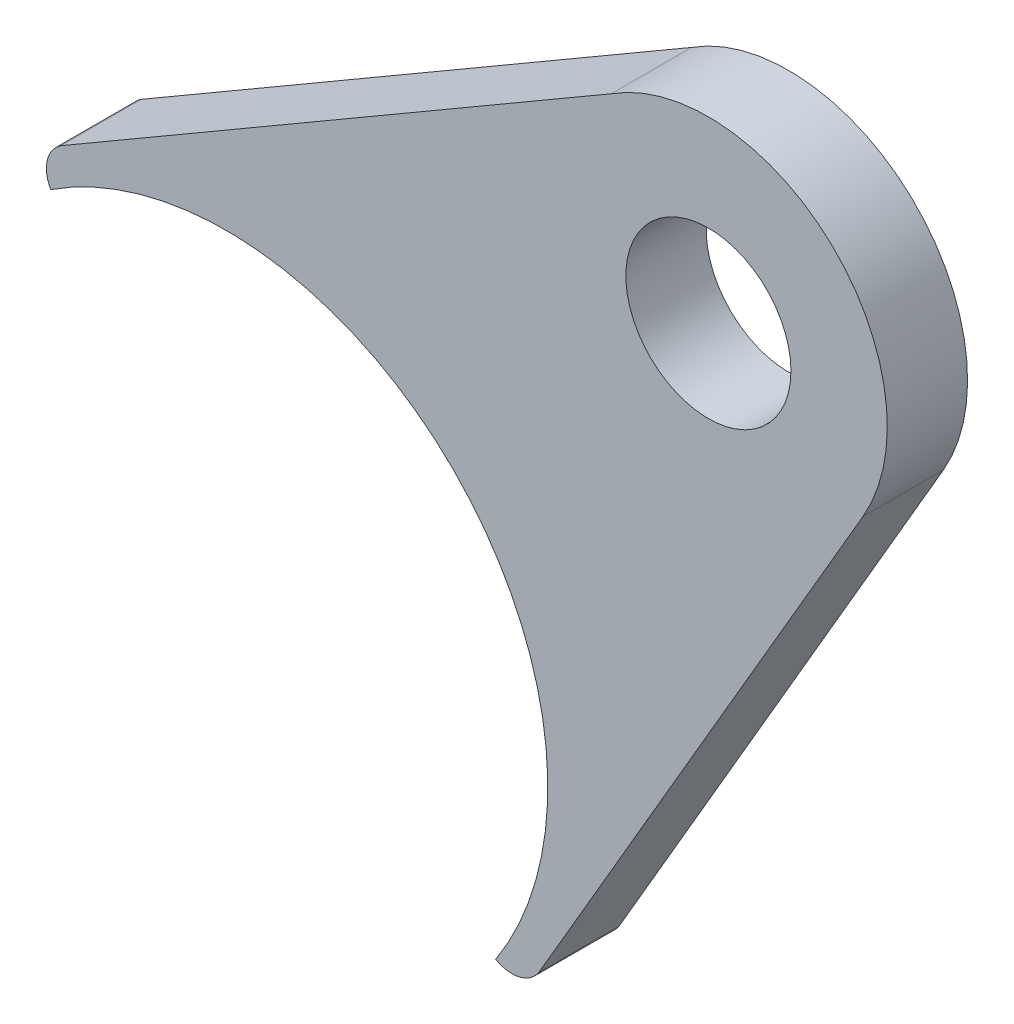
ISO-10303-21;
HEADER;
FILE_DESCRIPTION(('STEP AP214'),'2;1');
FILE_NAME('part.step','',(''),(''),'','','');
FILE_SCHEMA(('AUTOMOTIVE_DESIGN { 1 0 10303 214 1 1 1 1 }'));
ENDSEC;
DATA;
#1=APPLICATION_CONTEXT('core data for automotive mechanical design processes');
#2=APPLICATION_PROTOCOL_DEFINITION('international standard','automotive_design',2000,#1);
#3=PRODUCT_CONTEXT('',#1,'mechanical');
#4=PRODUCT('Part','Part','',(#3));
#5=PRODUCT_RELATED_PRODUCT_CATEGORY('part','',(#4));
#6=PRODUCT_DEFINITION_FORMATION('','',#4);
#7=PRODUCT_DEFINITION_CONTEXT('part definition',#1,'design');
#8=PRODUCT_DEFINITION('design','',#6,#7);
#9=PRODUCT_DEFINITION_SHAPE('','',#8);
#10=(LENGTH_UNIT() NAMED_UNIT(*) SI_UNIT(.MILLI.,.METRE.));
#11=(NAMED_UNIT(*) PLANE_ANGLE_UNIT() SI_UNIT($,.RADIAN.));
#12=(NAMED_UNIT(*) SI_UNIT($,.STERADIAN.) SOLID_ANGLE_UNIT());
#13=UNCERTAINTY_MEASURE_WITH_UNIT(LENGTH_MEASURE(1.E-05),#10,'distance_accuracy_value','');
#14=(GEOMETRIC_REPRESENTATION_CONTEXT(3) GLOBAL_UNCERTAINTY_ASSIGNED_CONTEXT((#13)) GLOBAL_UNIT_ASSIGNED_CONTEXT((#10,
#11,#12)) REPRESENTATION_CONTEXT('',''));
#15=CARTESIAN_POINT('',(0.,0.,0.));
#16=DIRECTION('',(0.,0.,1.));
#17=DIRECTION('',(1.,0.,0.));
#18=AXIS2_PLACEMENT_3D('',#15,#16,#17);
#19=CARTESIAN_POINT('',(-5.85837434433906,11.2675371729913,3.175));
#20=DIRECTION('',(0.,0.,-1.));
#21=DIRECTION('',(-1.,0.,0.));
#22=AXIS2_PLACEMENT_3D('',#19,#20,#21);
#23=PLANE('',#22);
#24=CARTESIAN_POINT('',(-5.85837434433906,11.2675371729913,3.175));
#25=DIRECTION('',(0.,0.,1.));
#26=DIRECTION('',(-1.,0.,0.));
#27=AXIS2_PLACEMENT_3D('',#24,#25,#26);
#28=CIRCLE('',#27,1.26999999999994);
#29=CARTESIAN_POINT('',(-6.54906316048158,12.3332993224671,3.175));
#30=VERTEX_POINT('',#29);
#31=CARTESIAN_POINT('',(-6.9547066047242,10.6264790049294,3.175));
#32=VERTEX_POINT('',#31);
#33=EDGE_CURVE('E141',#30,#32,#28,.T.);
#34=ORIENTED_EDGE('',*,*,#33,.T.);
#35=CARTESIAN_POINT('',(0.,0.,3.175));
#36=DIRECTION('',(0.,0.,-1.));
#37=DIRECTION('',(1.,0.,0.));
#38=AXIS2_PLACEMENT_3D('',#35,#36,#37);
#39=CIRCLE('',#38,12.7);
#40=CARTESIAN_POINT('',(10.6407084109418,-6.93291601804849,3.175));
#41=VERTEX_POINT('',#40);
#42=EDGE_CURVE('E99',#32,#41,#39,.T.);
#43=ORIENTED_EDGE('',*,*,#42,.T.);
#44=CARTESIAN_POINT('',(11.2818459493319,-5.83663017171689,3.175));
#45=DIRECTION('',(0.,0.,1.));
#46=DIRECTION('',(1.,0.,0.));
#47=AXIS2_PLACEMENT_3D('',#44,#45,#46);
#48=CIRCLE('',#47,1.27);
#49=CARTESIAN_POINT('',(12.3488934742751,-6.52533154351209,3.175));
#50=VERTEX_POINT('',#49);
#51=EDGE_CURVE('E112',#41,#50,#48,.T.);
#52=ORIENTED_EDGE('',*,*,#51,.T.);
#53=DIRECTION('',(0.503040153440547,0.864263040993025,0.));
#54=VECTOR('',#53,1.);
#55=CARTESIAN_POINT('',(12.3488934742751,-6.52533154351209,3.175));
#56=LINE('',#55,#54);
#57=CARTESIAN_POINT('',(25.1637103256806,15.4915442585769,3.175));
#58=VERTEX_POINT('',#57);
#59=EDGE_CURVE('E106',#50,#58,#56,.T.);
#60=ORIENTED_EDGE('',*,*,#59,.T.);
#61=CARTESIAN_POINT('',(19.05,19.05,3.175));
#62=DIRECTION('',(0.,0.,1.));
#63=DIRECTION('',(1.,0.,0.));
#64=AXIS2_PLACEMENT_3D('',#61,#62,#63);
#65=CIRCLE('',#64,7.07389999999995);
#66=CARTESIAN_POINT('',(15.2028632940858,24.9862951725809,3.175));
#67=VERTEX_POINT('',#66);
#68=EDGE_CURVE('E110',#58,#67,#65,.T.);
#69=ORIENTED_EDGE('',*,*,#68,.T.);
#70=DIRECTION('',(-0.86439446197605,-0.502814293855232,0.));
#71=VECTOR('',#70,1.);
#72=CARTESIAN_POINT('',(-6.54906316048158,12.3332993224671,3.175));
#73=LINE('',#72,#71);
#74=EDGE_CURVE('E62',#67,#30,#73,.T.);
#75=ORIENTED_EDGE('',*,*,#74,.T.);
#76=EDGE_LOOP('',(#34,#43,#52,#60,#69,#75));
#77=FACE_BOUND('',#76,.T.);
#78=CARTESIAN_POINT('',(19.05,19.05,3.175));
#79=DIRECTION('',(0.,0.,1.));
#80=DIRECTION('',(1.,0.,0.));
#81=AXIS2_PLACEMENT_3D('',#78,#79,#80);
#82=CIRCLE('',#81,3.2639);
#83=CARTESIAN_POINT('',(22.3139,19.05,3.175));
#84=VERTEX_POINT('',#83);
#85=EDGE_CURVE('E134',#84,#84,#82,.T.);
#86=ORIENTED_EDGE('',*,*,#85,.F.);
#87=EDGE_LOOP('',(#86));
#88=FACE_BOUND('',#87,.T.);
#89=ADVANCED_FACE('F45',(#77,#88),#23,.F.);
#90=CARTESIAN_POINT('',(-5.85837434433906,11.2675371729913,0.));
#91=DIRECTION('',(0.,0.,-1.));
#92=DIRECTION('',(-1.,0.,0.));
#93=AXIS2_PLACEMENT_3D('',#90,#91,#92);
#94=PLANE('',#93);
#95=CARTESIAN_POINT('',(-5.85837434433906,11.2675371729913,0.));
#96=DIRECTION('',(0.,0.,1.));
#97=DIRECTION('',(-1.,0.,0.));
#98=AXIS2_PLACEMENT_3D('',#95,#96,#97);
#99=CIRCLE('',#98,1.26999999999994);
#100=CARTESIAN_POINT('',(-6.54906316048158,12.3332993224671,0.));
#101=VERTEX_POINT('',#100);
#102=CARTESIAN_POINT('',(-6.9547066047242,10.6264790049294,0.));
#103=VERTEX_POINT('',#102);
#104=EDGE_CURVE('E130',#101,#103,#99,.T.);
#105=ORIENTED_EDGE('',*,*,#104,.F.);
#106=DIRECTION('',(-0.86439446197605,-0.502814293855232,0.));
#107=VECTOR('',#106,1.);
#108=CARTESIAN_POINT('',(-6.54906316048158,12.3332993224671,0.));
#109=LINE('',#108,#107);
#110=CARTESIAN_POINT('',(15.2028632940858,24.9862951725809,0.));
#111=VERTEX_POINT('',#110);
#112=EDGE_CURVE('E91',#111,#101,#109,.T.);
#113=ORIENTED_EDGE('',*,*,#112,.F.);
#114=CARTESIAN_POINT('',(19.05,19.05,0.));
#115=DIRECTION('',(0.,0.,1.));
#116=DIRECTION('',(1.,0.,0.));
#117=AXIS2_PLACEMENT_3D('',#114,#115,#116);
#118=CIRCLE('',#117,7.07389999999995);
#119=CARTESIAN_POINT('',(25.1637103256806,15.4915442585769,0.));
#120=VERTEX_POINT('',#119);
#121=EDGE_CURVE('E85',#120,#111,#118,.T.);
#122=ORIENTED_EDGE('',*,*,#121,.F.);
#123=DIRECTION('',(0.503040153440547,0.864263040993025,0.));
#124=VECTOR('',#123,1.);
#125=CARTESIAN_POINT('',(12.3488934742751,-6.52533154351209,0.));
#126=LINE('',#125,#124);
#127=CARTESIAN_POINT('',(12.3488934742751,-6.52533154351209,0.));
#128=VERTEX_POINT('',#127);
#129=EDGE_CURVE('E120',#128,#120,#126,.T.);
#130=ORIENTED_EDGE('',*,*,#129,.F.);
#131=CARTESIAN_POINT('',(11.2818459493319,-5.83663017171689,0.));
#132=DIRECTION('',(0.,0.,1.));
#133=DIRECTION('',(1.,0.,0.));
#134=AXIS2_PLACEMENT_3D('',#131,#132,#133);
#135=CIRCLE('',#134,1.27);
#136=CARTESIAN_POINT('',(10.6407084109418,-6.93291601804849,0.));
#137=VERTEX_POINT('',#136);
#138=EDGE_CURVE('E136',#137,#128,#135,.T.);
#139=ORIENTED_EDGE('',*,*,#138,.F.);
#140=CARTESIAN_POINT('',(0.,0.,0.));
#141=DIRECTION('',(0.,0.,-1.));
#142=DIRECTION('',(1.,0.,0.));
#143=AXIS2_PLACEMENT_3D('',#140,#141,#142);
#144=CIRCLE('',#143,12.7);
#145=EDGE_CURVE('E133',#103,#137,#144,.T.);
#146=ORIENTED_EDGE('',*,*,#145,.F.);
#147=EDGE_LOOP('',(#105,#113,#122,#130,#139,#146));
#148=FACE_BOUND('',#147,.T.);
#149=CARTESIAN_POINT('',(19.05,19.05,0.));
#150=DIRECTION('',(0.,0.,1.));
#151=DIRECTION('',(1.,0.,0.));
#152=AXIS2_PLACEMENT_3D('',#149,#150,#151);
#153=CIRCLE('',#152,3.2639);
#154=CARTESIAN_POINT('',(22.3139,19.05,0.));
#155=VERTEX_POINT('',#154);
#156=EDGE_CURVE('E234',#155,#155,#153,.T.);
#157=ORIENTED_EDGE('',*,*,#156,.T.);
#158=EDGE_LOOP('',(#157));
#159=FACE_BOUND('',#158,.T.);
#160=ADVANCED_FACE('F150',(#148,#159),#94,.T.);
#161=CARTESIAN_POINT('',(-5.85837434433906,11.2675371729913,3.175));
#162=DIRECTION('',(0.,0.,-1.));
#163=DIRECTION('',(-1.,0.,0.));
#164=AXIS2_PLACEMENT_3D('',#161,#162,#163);
#165=CYLINDRICAL_SURFACE('',#164,1.26999999999994);
#166=ORIENTED_EDGE('',*,*,#104,.T.);
#167=DIRECTION('',(0.,0.,-1.));
#168=VECTOR('',#167,1.);
#169=CARTESIAN_POINT('',(-6.9547066047242,10.6264790049294,3.175));
#170=LINE('',#169,#168);
#171=EDGE_CURVE('E11',#32,#103,#170,.T.);
#172=ORIENTED_EDGE('',*,*,#171,.F.);
#173=ORIENTED_EDGE('',*,*,#33,.F.);
#174=DIRECTION('',(0.,0.,-1.));
#175=VECTOR('',#174,1.);
#176=CARTESIAN_POINT('',(-6.54906316048158,12.3332993224671,3.175));
#177=LINE('',#176,#175);
#178=EDGE_CURVE('E126',#30,#101,#177,.T.);
#179=ORIENTED_EDGE('',*,*,#178,.T.);
#180=EDGE_LOOP('',(#166,#172,#173,#179));
#181=FACE_BOUND('',#180,.T.);
#182=ADVANCED_FACE('F47',(#181),#165,.T.);
#183=CARTESIAN_POINT('',(0.,0.,3.175));
#184=DIRECTION('',(0.,0.,-1.));
#185=DIRECTION('',(-1.,0.,0.));
#186=AXIS2_PLACEMENT_3D('',#183,#184,#185);
#187=CYLINDRICAL_SURFACE('',#186,12.7);
#188=ORIENTED_EDGE('',*,*,#145,.T.);
#189=DIRECTION('',(0.,0.,-1.));
#190=VECTOR('',#189,1.);
#191=CARTESIAN_POINT('',(10.6407084109418,-6.93291601804849,3.175));
#192=LINE('',#191,#190);
#193=EDGE_CURVE('E54',#41,#137,#192,.T.);
#194=ORIENTED_EDGE('',*,*,#193,.F.);
#195=ORIENTED_EDGE('',*,*,#42,.F.);
#196=ORIENTED_EDGE('',*,*,#171,.T.);
#197=EDGE_LOOP('',(#188,#194,#195,#196));
#198=FACE_BOUND('',#197,.T.);
#199=ADVANCED_FACE('F175',(#198),#187,.F.);
#200=CARTESIAN_POINT('',(11.2818459493319,-5.83663017171689,3.175));
#201=DIRECTION('',(0.,0.,-1.));
#202=DIRECTION('',(-1.,0.,0.));
#203=AXIS2_PLACEMENT_3D('',#200,#201,#202);
#204=CYLINDRICAL_SURFACE('',#203,1.27);
#205=ORIENTED_EDGE('',*,*,#138,.T.);
#206=DIRECTION('',(0.,0.,-1.));
#207=VECTOR('',#206,1.);
#208=CARTESIAN_POINT('',(12.3488934742751,-6.52533154351209,3.175));
#209=LINE('',#208,#207);
#210=EDGE_CURVE('E121',#50,#128,#209,.T.);
#211=ORIENTED_EDGE('',*,*,#210,.F.);
#212=ORIENTED_EDGE('',*,*,#51,.F.);
#213=ORIENTED_EDGE('',*,*,#193,.T.);
#214=EDGE_LOOP('',(#205,#211,#212,#213));
#215=FACE_BOUND('',#214,.T.);
#216=ADVANCED_FACE('F147',(#215),#204,.T.);
#217=CARTESIAN_POINT('',(12.3488934742751,-6.52533154351209,3.175));
#218=DIRECTION('',(-0.864263040993025,0.503040153440547,0.));
#219=DIRECTION('',(-0.503040153440547,-0.864263040993025,0.));
#220=AXIS2_PLACEMENT_3D('',#217,#218,#219);
#221=PLANE('',#220);
#222=ORIENTED_EDGE('',*,*,#129,.T.);
#223=DIRECTION('',(0.,0.,-1.));
#224=VECTOR('',#223,1.);
#225=CARTESIAN_POINT('',(25.1637103256806,15.4915442585769,3.175));
#226=LINE('',#225,#224);
#227=EDGE_CURVE('E117',#58,#120,#226,.T.);
#228=ORIENTED_EDGE('',*,*,#227,.F.);
#229=ORIENTED_EDGE('',*,*,#59,.F.);
#230=ORIENTED_EDGE('',*,*,#210,.T.);
#231=EDGE_LOOP('',(#222,#228,#229,#230));
#232=FACE_BOUND('',#231,.T.);
#233=ADVANCED_FACE('F118',(#232),#221,.F.);
#234=CARTESIAN_POINT('',(19.05,19.05,3.175));
#235=DIRECTION('',(0.,0.,-1.));
#236=DIRECTION('',(-1.,0.,0.));
#237=AXIS2_PLACEMENT_3D('',#234,#235,#236);
#238=CYLINDRICAL_SURFACE('',#237,7.07389999999995);
#239=ORIENTED_EDGE('',*,*,#121,.T.);
#240=DIRECTION('',(0.,0.,-1.));
#241=VECTOR('',#240,1.);
#242=CARTESIAN_POINT('',(15.2028632940858,24.9862951725809,3.175));
#243=LINE('',#242,#241);
#244=EDGE_CURVE('E122',#67,#111,#243,.T.);
#245=ORIENTED_EDGE('',*,*,#244,.F.);
#246=ORIENTED_EDGE('',*,*,#68,.F.);
#247=ORIENTED_EDGE('',*,*,#227,.T.);
#248=EDGE_LOOP('',(#239,#245,#246,#247));
#249=FACE_BOUND('',#248,.T.);
#250=ADVANCED_FACE('F124',(#249),#238,.T.);
#251=CARTESIAN_POINT('',(-6.54906316048158,12.3332993224671,3.175));
#252=DIRECTION('',(0.502814293855232,-0.86439446197605,0.));
#253=DIRECTION('',(0.86439446197605,0.502814293855232,0.));
#254=AXIS2_PLACEMENT_3D('',#251,#252,#253);
#255=PLANE('',#254);
#256=ORIENTED_EDGE('',*,*,#112,.T.);
#257=ORIENTED_EDGE('',*,*,#178,.F.);
#258=ORIENTED_EDGE('',*,*,#74,.F.);
#259=ORIENTED_EDGE('',*,*,#244,.T.);
#260=EDGE_LOOP('',(#256,#257,#258,#259));
#261=FACE_BOUND('',#260,.T.);
#262=ADVANCED_FACE('F155',(#261),#255,.F.);
#263=CARTESIAN_POINT('',(19.05,19.05,3.175));
#264=DIRECTION('',(0.,0.,-1.));
#265=DIRECTION('',(-1.,0.,0.));
#266=AXIS2_PLACEMENT_3D('',#263,#264,#265);
#267=CYLINDRICAL_SURFACE('',#266,3.2639);
#268=ORIENTED_EDGE('',*,*,#85,.T.);
#269=EDGE_LOOP('',(#268));
#270=FACE_BOUND('',#269,.T.);
#271=ORIENTED_EDGE('',*,*,#156,.F.);
#272=EDGE_LOOP('',(#271));
#273=FACE_BOUND('',#272,.T.);
#274=ADVANCED_FACE('F157',(#270,#273),#267,.F.);
#275=CLOSED_SHELL('',(#89,#160,#182,#199,#216,#233,#250,#262,#274));
#276=MANIFOLD_SOLID_BREP('B2',#275);
#277=ADVANCED_BREP_SHAPE_REPRESENTATION('',(#18,#276),#14);
#278=SHAPE_DEFINITION_REPRESENTATION(#9,#277);
ENDSEC;
END-ISO-10303-21;
